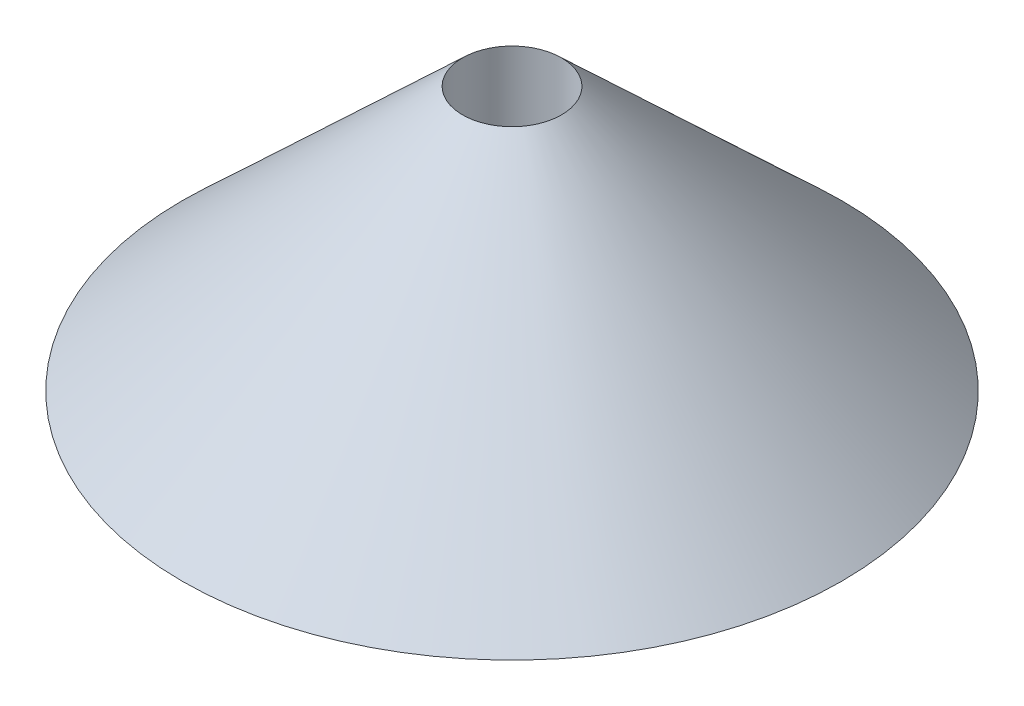
ISO-10303-21;
HEADER;
FILE_DESCRIPTION(('STEP AP214'),'2;1');
FILE_NAME('part.step','',(''),(''),'','','');
FILE_SCHEMA(('AUTOMOTIVE_DESIGN { 1 0 10303 214 1 1 1 1 }'));
ENDSEC;
DATA;
#1=APPLICATION_CONTEXT('core data for automotive mechanical design processes');
#2=APPLICATION_PROTOCOL_DEFINITION('international standard','automotive_design',2000,#1);
#3=PRODUCT_CONTEXT('',#1,'mechanical');
#4=PRODUCT('Part','Part','',(#3));
#5=PRODUCT_RELATED_PRODUCT_CATEGORY('part','',(#4));
#6=PRODUCT_DEFINITION_FORMATION('','',#4);
#7=PRODUCT_DEFINITION_CONTEXT('part definition',#1,'design');
#8=PRODUCT_DEFINITION('design','',#6,#7);
#9=PRODUCT_DEFINITION_SHAPE('','',#8);
#10=(LENGTH_UNIT() NAMED_UNIT(*) SI_UNIT(.MILLI.,.METRE.));
#11=(NAMED_UNIT(*) PLANE_ANGLE_UNIT() SI_UNIT($,.RADIAN.));
#12=(NAMED_UNIT(*) SI_UNIT($,.STERADIAN.) SOLID_ANGLE_UNIT());
#13=UNCERTAINTY_MEASURE_WITH_UNIT(LENGTH_MEASURE(1.E-05),#10,'distance_accuracy_value','');
#14=(GEOMETRIC_REPRESENTATION_CONTEXT(3) GLOBAL_UNCERTAINTY_ASSIGNED_CONTEXT((#13)) GLOBAL_UNIT_ASSIGNED_CONTEXT((#10,
#11,#12)) REPRESENTATION_CONTEXT('',''));
#15=CARTESIAN_POINT('',(0.,0.,0.));
#16=DIRECTION('',(0.,0.,1.));
#17=DIRECTION('',(1.,0.,0.));
#18=AXIS2_PLACEMENT_3D('',#15,#16,#17);
#19=CARTESIAN_POINT('',(-32.8121314133408,6.63934041855087,0.));
#20=DIRECTION('',(0.,-1.,0.));
#21=DIRECTION('',(0.,0.,-1.));
#22=AXIS2_PLACEMENT_3D('',#19,#20,#21);
#23=PLANE('',#22);
#24=CARTESIAN_POINT('',(-32.8121314133408,6.63934041855087,0.));
#25=DIRECTION('',(0.,-1.,0.));
#26=DIRECTION('',(0.,0.,-1.));
#27=AXIS2_PLACEMENT_3D('',#24,#25,#26);
#28=CIRCLE('',#27,1.5);
#29=CARTESIAN_POINT('',(-32.8121314133408,6.63934041855087,-1.5));
#30=VERTEX_POINT('',#29);
#31=EDGE_CURVE('E10',#30,#30,#28,.T.);
#32=ORIENTED_EDGE('',*,*,#31,.F.);
#33=EDGE_LOOP('',(#32));
#34=FACE_BOUND('',#33,.T.);
#35=ADVANCED_FACE('F31',(#34),#23,.F.);
#36=CARTESIAN_POINT('',(-32.8121314133408,3.63934041855087,0.));
#37=DIRECTION('',(0.,-1.,0.));
#38=DIRECTION('',(0.,0.,-1.));
#39=AXIS2_PLACEMENT_3D('',#36,#37,#38);
#40=CYLINDRICAL_SURFACE('',#39,1.5);
#41=CARTESIAN_POINT('',(-32.8121314133408,11.6393404185509,0.));
#42=DIRECTION('',(0.,-1.,0.));
#43=DIRECTION('',(0.,0.,-1.));
#44=AXIS2_PLACEMENT_3D('',#41,#42,#43);
#45=CIRCLE('',#44,1.5);
#46=CARTESIAN_POINT('',(-32.8121314133408,11.6393404185509,-1.5));
#47=VERTEX_POINT('',#46);
#48=EDGE_CURVE('E37',#47,#47,#45,.T.);
#49=ORIENTED_EDGE('',*,*,#48,.F.);
#50=EDGE_LOOP('',(#49));
#51=FACE_BOUND('',#50,.T.);
#52=ORIENTED_EDGE('',*,*,#31,.T.);
#53=EDGE_LOOP('',(#52));
#54=FACE_BOUND('',#53,.T.);
#55=ADVANCED_FACE('F52',(#51,#54),#40,.F.);
#56=CARTESIAN_POINT('',(-32.8121314133408,11.6393404185509,0.));
#57=DIRECTION('',(0.,-1.,0.));
#58=DIRECTION('',(0.,0.,-1.));
#59=AXIS2_PLACEMENT_3D('',#56,#57,#58);
#60=CONICAL_SURFACE('',#59,1.5,0.815691923316224);
#61=CARTESIAN_POINT('',(-32.8121314133408,3.63934041855087,0.));
#62=DIRECTION('',(0.,-1.,0.));
#63=DIRECTION('',(0.,0.,-1.));
#64=AXIS2_PLACEMENT_3D('',#61,#62,#63);
#65=CIRCLE('',#64,10.);
#66=CARTESIAN_POINT('',(-32.8121314133408,3.63934041855087,-10.));
#67=VERTEX_POINT('',#66);
#68=EDGE_CURVE('E41',#67,#67,#65,.T.);
#69=CARTESIAN_POINT('',(-32.8121314133408,3.63934041855087,-10.));
#70=CARTESIAN_POINT('',(-32.8121314133408,3.72267375188421,-9.91145833333334));
#71=CARTESIAN_POINT('',(-32.8121314133408,3.80600708521754,-9.82291666666667));
#72=CARTESIAN_POINT('',(-32.8121314133408,3.97267375188421,-9.64583333333334));
#73=CARTESIAN_POINT('',(-32.8121314133408,4.05600708521754,-9.55729166666667));
#74=CARTESIAN_POINT('',(-32.8121314133408,4.22267375188421,-9.38020833333334));
#75=CARTESIAN_POINT('',(-32.8121314133408,4.30600708521754,-9.29166666666667));
#76=CARTESIAN_POINT('',(-32.8121314133408,4.47267375188421,-9.11458333333334));
#77=CARTESIAN_POINT('',(-32.8121314133408,4.55600708521754,-9.02604166666667));
#78=CARTESIAN_POINT('',(-32.8121314133408,4.72267375188421,-8.84895833333334));
#79=CARTESIAN_POINT('',(-32.8121314133408,4.80600708521754,-8.76041666666667));
#80=CARTESIAN_POINT('',(-32.8121314133408,4.97267375188421,-8.58333333333334));
#81=CARTESIAN_POINT('',(-32.8121314133408,5.05600708521754,-8.49479166666667));
#82=CARTESIAN_POINT('',(-32.8121314133408,5.22267375188421,-8.31770833333334));
#83=CARTESIAN_POINT('',(-32.8121314133408,5.30600708521754,-8.22916666666667));
#84=CARTESIAN_POINT('',(-32.8121314133408,5.47267375188421,-8.05208333333334));
#85=CARTESIAN_POINT('',(-32.8121314133408,5.55600708521754,-7.96354166666667));
#86=CARTESIAN_POINT('',(-32.8121314133408,5.72267375188421,-7.78645833333334));
#87=CARTESIAN_POINT('',(-32.8121314133408,5.80600708521754,-7.69791666666667));
#88=CARTESIAN_POINT('',(-32.8121314133408,5.97267375188421,-7.52083333333334));
#89=CARTESIAN_POINT('',(-32.8121314133408,6.05600708521754,-7.43229166666667));
#90=CARTESIAN_POINT('',(-32.8121314133408,6.22267375188421,-7.25520833333334));
#91=CARTESIAN_POINT('',(-32.8121314133408,6.30600708521754,-7.16666666666667));
#92=CARTESIAN_POINT('',(-32.8121314133408,6.47267375188421,-6.98958333333334));
#93=CARTESIAN_POINT('',(-32.8121314133408,6.55600708521754,-6.90104166666667));
#94=CARTESIAN_POINT('',(-32.8121314133408,6.72267375188421,-6.72395833333334));
#95=CARTESIAN_POINT('',(-32.8121314133408,6.80600708521754,-6.63541666666667));
#96=CARTESIAN_POINT('',(-32.8121314133408,6.97267375188421,-6.45833333333334));
#97=CARTESIAN_POINT('',(-32.8121314133408,7.05600708521754,-6.36979166666667));
#98=CARTESIAN_POINT('',(-32.8121314133408,7.22267375188421,-6.19270833333334));
#99=CARTESIAN_POINT('',(-32.8121314133408,7.30600708521754,-6.10416666666667));
#100=CARTESIAN_POINT('',(-32.8121314133408,7.47267375188421,-5.92708333333334));
#101=CARTESIAN_POINT('',(-32.8121314133408,7.55600708521754,-5.83854166666667));
#102=CARTESIAN_POINT('',(-32.8121314133408,7.72267375188421,-5.66145833333334));
#103=CARTESIAN_POINT('',(-32.8121314133408,7.80600708521754,-5.57291666666667));
#104=CARTESIAN_POINT('',(-32.8121314133408,7.97267375188421,-5.39583333333333));
#105=CARTESIAN_POINT('',(-32.8121314133408,8.05600708521754,-5.30729166666667));
#106=CARTESIAN_POINT('',(-32.8121314133408,8.22267375188421,-5.13020833333333));
#107=CARTESIAN_POINT('',(-32.8121314133408,8.30600708521754,-5.04166666666667));
#108=CARTESIAN_POINT('',(-32.8121314133408,8.47267375188421,-4.86458333333334));
#109=CARTESIAN_POINT('',(-32.8121314133408,8.55600708521754,-4.77604166666667));
#110=CARTESIAN_POINT('',(-32.8121314133408,8.72267375188421,-4.59895833333334));
#111=CARTESIAN_POINT('',(-32.8121314133408,8.80600708521754,-4.51041666666667));
#112=CARTESIAN_POINT('',(-32.8121314133408,8.97267375188421,-4.33333333333334));
#113=CARTESIAN_POINT('',(-32.8121314133408,9.05600708521754,-4.24479166666667));
#114=CARTESIAN_POINT('',(-32.8121314133408,9.22267375188421,-4.06770833333334));
#115=CARTESIAN_POINT('',(-32.8121314133408,9.30600708521754,-3.97916666666667));
#116=CARTESIAN_POINT('',(-32.8121314133408,9.47267375188421,-3.80208333333334));
#117=CARTESIAN_POINT('',(-32.8121314133408,9.55600708521754,-3.71354166666667));
#118=CARTESIAN_POINT('',(-32.8121314133408,9.72267375188421,-3.53645833333333));
#119=CARTESIAN_POINT('',(-32.8121314133408,9.80600708521754,-3.44791666666667));
#120=CARTESIAN_POINT('',(-32.8121314133408,9.97267375188421,-3.27083333333333));
#121=CARTESIAN_POINT('',(-32.8121314133408,10.0560070852175,-3.18229166666667));
#122=CARTESIAN_POINT('',(-32.8121314133408,10.2226737518842,-3.00520833333333));
#123=CARTESIAN_POINT('',(-32.8121314133408,10.3060070852175,-2.91666666666667));
#124=CARTESIAN_POINT('',(-32.8121314133408,10.4726737518842,-2.73958333333333));
#125=CARTESIAN_POINT('',(-32.8121314133408,10.5560070852175,-2.65104166666667));
#126=CARTESIAN_POINT('',(-32.8121314133408,10.7226737518842,-2.47395833333333));
#127=CARTESIAN_POINT('',(-32.8121314133408,10.8060070852175,-2.38541666666667));
#128=CARTESIAN_POINT('',(-32.8121314133408,10.9726737518842,-2.20833333333333));
#129=CARTESIAN_POINT('',(-32.8121314133408,11.0560070852175,-2.11979166666667));
#130=CARTESIAN_POINT('',(-32.8121314133408,11.2226737518842,-1.94270833333334));
#131=CARTESIAN_POINT('',(-32.8121314133408,11.3060070852175,-1.85416666666667));
#132=CARTESIAN_POINT('',(-32.8121314133408,11.4726737518842,-1.67708333333333));
#133=CARTESIAN_POINT('',(-32.8121314133408,11.5560070852175,-1.58854166666667));
#134=CARTESIAN_POINT('',(-32.8121314133408,11.6393404185509,-1.5));
#135=B_SPLINE_CURVE_WITH_KNOTS('',3,(#69,#70,#71,#72,#73,#74,#75,#76,#77,#78,#79,#80,#81,#82,
#83,#84,#85,#86,#87,#88,#89,#90,#91,#92,#93,#94,#95,#96,#97,#98,#99,#100,#101,#102,#103,#104,
#105,#106,#107,#108,#109,#110,#111,#112,#113,#114,#115,#116,#117,#118,#119,#120,#121,#122,#123,
#124,#125,#126,#127,#128,#129,#130,#131,#132,#133,#134),.UNSPECIFIED.,.F.,.F.,(4,2,2,2,2,2,2,2,
2,2,2,2,2,2,2,2,2,2,2,2,2,2,2,2,2,2,2,2,2,2,2,2,4),(0.,0.364769297810274,0.729538595620548,
1.09430789343082,1.45907719124109,1.82384648905137,2.18861578686164,2.55338508467192,
2.91815438248219,3.28292368029246,3.64769297810274,4.01246227591301,4.37723157372328,
4.74200087153356,5.10677016934383,5.4715394671541,5.83630876496438,6.20107806277465,
6.56584736058493,6.9306166583952,7.29538595620547,7.66015525401575,8.02492455182602,
8.38969384963629,8.75446314744657,9.11923244525684,9.48400174306711,9.84877104087739,
10.2135403386877,10.5783096364979,10.9430789343082,11.3078482321185,11.6726175299288),.UNSPECIFIED.);
#136=EDGE_CURVE('BSEAM50',#67,#47,#135,.T.);
#137=ORIENTED_EDGE('',*,*,#68,.F.);
#138=ORIENTED_EDGE('',*,*,#48,.T.);
#139=ORIENTED_EDGE('',*,*,#136,.T.);
#140=ORIENTED_EDGE('',*,*,#136,.F.);
#141=EDGE_LOOP('',(#137,#139,#138,#140));
#142=FACE_BOUND('',#141,.T.);
#143=ADVANCED_FACE('F50',(#142),#60,.T.);
#144=CARTESIAN_POINT('',(-32.8121314133408,3.63934041855087,0.));
#145=DIRECTION('',(0.,1.,0.));
#146=DIRECTION('',(0.,0.,1.));
#147=AXIS2_PLACEMENT_3D('',#144,#145,#146);
#148=PLANE('',#147);
#149=ORIENTED_EDGE('',*,*,#68,.T.);
#150=EDGE_LOOP('',(#149));
#151=FACE_BOUND('',#150,.T.);
#152=ADVANCED_FACE('F48',(#151),#148,.F.);
#153=CLOSED_SHELL('',(#35,#55,#143,#152));
#154=MANIFOLD_SOLID_BREP('B2',#153);
#155=ADVANCED_BREP_SHAPE_REPRESENTATION('',(#18,#154),#14);
#156=SHAPE_DEFINITION_REPRESENTATION(#9,#155);
ENDSEC;
END-ISO-10303-21;
